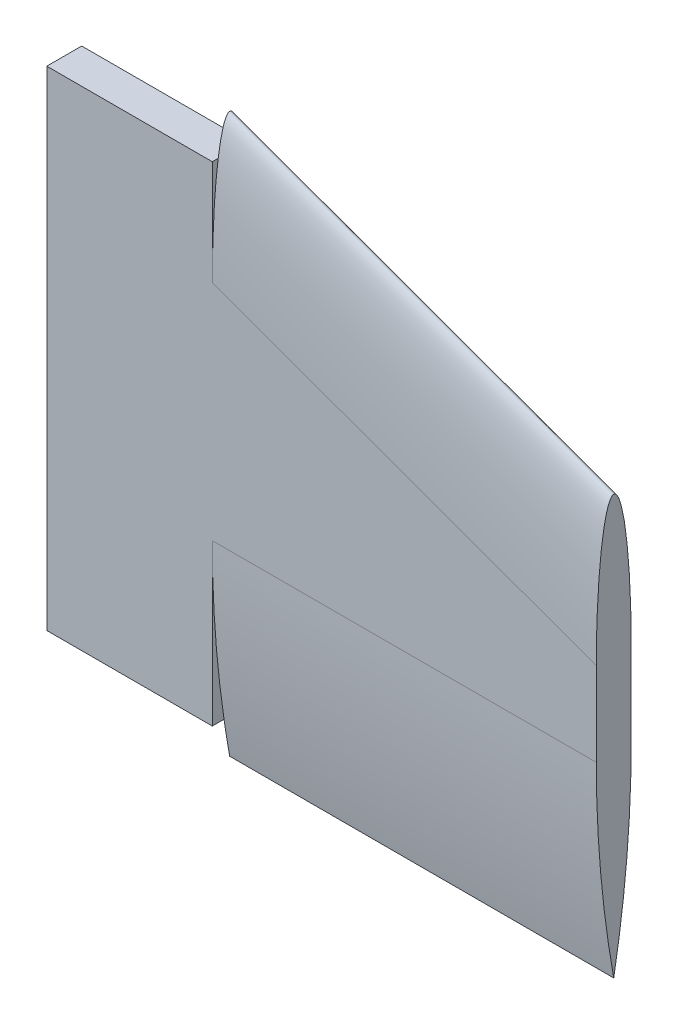
ISO-10303-21;
HEADER;
FILE_DESCRIPTION(('STEP AP214'),'2;1');
FILE_NAME('part.step','',(''),(''),'','','');
FILE_SCHEMA(('AUTOMOTIVE_DESIGN { 1 0 10303 214 1 1 1 1 }'));
ENDSEC;
DATA;
#1=APPLICATION_CONTEXT('core data for automotive mechanical design processes');
#2=APPLICATION_PROTOCOL_DEFINITION('international standard','automotive_design',2000,#1);
#3=PRODUCT_CONTEXT('',#1,'mechanical');
#4=PRODUCT('Part','Part','',(#3));
#5=PRODUCT_RELATED_PRODUCT_CATEGORY('part','',(#4));
#6=PRODUCT_DEFINITION_FORMATION('','',#4);
#7=PRODUCT_DEFINITION_CONTEXT('part definition',#1,'design');
#8=PRODUCT_DEFINITION('design','',#6,#7);
#9=PRODUCT_DEFINITION_SHAPE('','',#8);
#10=(LENGTH_UNIT() NAMED_UNIT(*) SI_UNIT(.MILLI.,.METRE.));
#11=(NAMED_UNIT(*) PLANE_ANGLE_UNIT() SI_UNIT($,.RADIAN.));
#12=(NAMED_UNIT(*) SI_UNIT($,.STERADIAN.) SOLID_ANGLE_UNIT());
#13=UNCERTAINTY_MEASURE_WITH_UNIT(LENGTH_MEASURE(1.E-05),#10,'distance_accuracy_value','');
#14=(GEOMETRIC_REPRESENTATION_CONTEXT(3) GLOBAL_UNCERTAINTY_ASSIGNED_CONTEXT((#13)) GLOBAL_UNIT_ASSIGNED_CONTEXT((#10,
#11,#12)) REPRESENTATION_CONTEXT('',''));
#15=CARTESIAN_POINT('',(0.,0.,0.));
#16=DIRECTION('',(0.,0.,1.));
#17=DIRECTION('',(1.,0.,0.));
#18=AXIS2_PLACEMENT_3D('',#15,#16,#17);
#19=CARTESIAN_POINT('',(78.7,55.,5.));
#20=DIRECTION('',(-1.,0.,0.));
#21=DIRECTION('',(0.,-1.,0.));
#22=AXIS2_PLACEMENT_3D('',#19,#20,#21);
#23=PLANE('',#22);
#24=CARTESIAN_POINT('',(78.7,23.,-153.05));
#25=DIRECTION('',(1.,0.,0.));
#26=DIRECTION('',(0.,1.,0.));
#27=AXIS2_PLACEMENT_3D('',#24,#25,#26);
#28=CIRCLE('',#27,158.05);
#29=CARTESIAN_POINT('',(78.7,23.,5.));
#30=VERTEX_POINT('',#29);
#31=CARTESIAN_POINT('',(78.7,-5.,2.5));
#32=VERTEX_POINT('',#31);
#33=EDGE_CURVE('E266',#30,#32,#28,.T.);
#34=ORIENTED_EDGE('',*,*,#33,.T.);
#35=CARTESIAN_POINT('',(78.7,23.,158.05));
#36=DIRECTION('',(1.,0.,0.));
#37=DIRECTION('',(0.,1.,0.));
#38=AXIS2_PLACEMENT_3D('',#35,#36,#37);
#39=CIRCLE('',#38,158.05);
#40=CARTESIAN_POINT('',(78.7,23.,0.));
#41=VERTEX_POINT('',#40);
#42=EDGE_CURVE('E304',#41,#32,#39,.F.);
#43=ORIENTED_EDGE('',*,*,#42,.F.);
#44=DIRECTION('',(0.,1.,0.));
#45=VECTOR('',#44,1.);
#46=CARTESIAN_POINT('',(78.7,55.,0.));
#47=LINE('',#46,#45);
#48=CARTESIAN_POINT('',(78.7,35.,0.));
#49=VERTEX_POINT('',#48);
#50=EDGE_CURVE('E143',#41,#49,#47,.T.);
#51=ORIENTED_EDGE('',*,*,#50,.T.);
#52=CARTESIAN_POINT('',(78.7,35.,2.5));
#53=DIRECTION('',(1.,0.,0.));
#54=DIRECTION('',(0.,1.,0.));
#55=AXIS2_PLACEMENT_3D('',#52,#53,#54);
#56=ELLIPSE('',#55,20.,2.5);
#57=CARTESIAN_POINT('',(78.7,35.,5.));
#58=VERTEX_POINT('',#57);
#59=EDGE_CURVE('E178',#49,#58,#56,.T.);
#60=ORIENTED_EDGE('',*,*,#59,.T.);
#61=DIRECTION('',(0.,1.,0.));
#62=VECTOR('',#61,1.);
#63=CARTESIAN_POINT('',(78.7,55.,5.));
#64=LINE('',#63,#62);
#65=EDGE_CURVE('E129',#30,#58,#64,.T.);
#66=ORIENTED_EDGE('',*,*,#65,.F.);
#67=EDGE_LOOP('',(#34,#43,#51,#60,#66));
#68=FACE_BOUND('',#67,.T.);
#69=ADVANCED_FACE('F58',(#68),#23,.F.);
#70=CARTESIAN_POINT('',(23.7,-5.,5.));
#71=DIRECTION('',(1.,0.,0.));
#72=DIRECTION('',(0.,1.,0.));
#73=AXIS2_PLACEMENT_3D('',#70,#71,#72);
#74=PLANE('',#73);
#75=DIRECTION('',(0.,0.,-1.));
#76=VECTOR('',#75,1.);
#77=CARTESIAN_POINT('',(23.7,0.,5.));
#78=LINE('',#77,#76);
#79=CARTESIAN_POINT('',(23.7,0.,3.31752380209902));
#80=VERTEX_POINT('',#79);
#81=CARTESIAN_POINT('',(23.7,0.,1.68247619790099));
#82=VERTEX_POINT('',#81);
#83=EDGE_CURVE('E68',#80,#82,#78,.T.);
#84=ORIENTED_EDGE('',*,*,#83,.T.);
#85=CARTESIAN_POINT('',(23.6999999999999,23.,158.05));
#86=DIRECTION('',(1.,0.,0.));
#87=DIRECTION('',(0.,1.,0.));
#88=AXIS2_PLACEMENT_3D('',#85,#86,#87);
#89=CIRCLE('',#88,158.05);
#90=CARTESIAN_POINT('',(23.6999999999996,-5.00000000000001,2.5));
#91=VERTEX_POINT('',#90);
#92=EDGE_CURVE('E259',#91,#82,#89,.T.);
#93=ORIENTED_EDGE('',*,*,#92,.F.);
#94=CARTESIAN_POINT('',(23.6999999999999,23.,-153.05));
#95=DIRECTION('',(1.,0.,0.));
#96=DIRECTION('',(0.,1.,0.));
#97=AXIS2_PLACEMENT_3D('',#94,#95,#96);
#98=CIRCLE('',#97,158.05);
#99=EDGE_CURVE('E248',#91,#80,#98,.F.);
#100=ORIENTED_EDGE('',*,*,#99,.T.);
#101=EDGE_LOOP('',(#84,#93,#100));
#102=FACE_BOUND('',#101,.T.);
#103=ADVANCED_FACE('F256',(#102),#74,.F.);
#104=CARTESIAN_POINT('',(0.,0.,0.));
#105=DIRECTION('',(0.,0.,-1.));
#106=DIRECTION('',(-1.,0.,0.));
#107=AXIS2_PLACEMENT_3D('',#104,#105,#106);
#108=PLANE('',#107);
#109=ORIENTED_EDGE('',*,*,#50,.F.);
#110=DIRECTION('',(1.,0.,0.));
#111=VECTOR('',#110,1.);
#112=CARTESIAN_POINT('',(-4.4113855937412,23.,0.));
#113=LINE('',#112,#111);
#114=CARTESIAN_POINT('',(23.6999999999999,23.,0.));
#115=VERTEX_POINT('',#114);
#116=EDGE_CURVE('E302',#115,#41,#113,.T.);
#117=ORIENTED_EDGE('',*,*,#116,.F.);
#118=DIRECTION('',(0.,-1.,0.));
#119=VECTOR('',#118,1.);
#120=CARTESIAN_POINT('',(23.7,0.,0.));
#121=LINE('',#120,#119);
#122=CARTESIAN_POINT('',(23.7,0.,0.));
#123=VERTEX_POINT('',#122);
#124=EDGE_CURVE('E309',#115,#123,#121,.T.);
#125=ORIENTED_EDGE('',*,*,#124,.T.);
#126=DIRECTION('',(1.,0.,0.));
#127=VECTOR('',#126,1.);
#128=CARTESIAN_POINT('',(23.7,0.,0.));
#129=LINE('',#128,#127);
#130=CARTESIAN_POINT('',(0.,0.,0.));
#131=VERTEX_POINT('',#130);
#132=EDGE_CURVE('E139',#131,#123,#129,.T.);
#133=ORIENTED_EDGE('',*,*,#132,.F.);
#134=DIRECTION('',(0.,-1.,0.));
#135=VECTOR('',#134,1.);
#136=CARTESIAN_POINT('',(0.,0.,0.));
#137=LINE('',#136,#135);
#138=CARTESIAN_POINT('',(0.,70.,0.));
#139=VERTEX_POINT('',#138);
#140=EDGE_CURVE('E149',#139,#131,#137,.T.);
#141=ORIENTED_EDGE('',*,*,#140,.F.);
#142=DIRECTION('',(-1.,0.,0.));
#143=VECTOR('',#142,1.);
#144=CARTESIAN_POINT('',(0.,70.,0.));
#145=LINE('',#144,#143);
#146=CARTESIAN_POINT('',(23.6999999999999,70.,0.));
#147=VERTEX_POINT('',#146);
#148=EDGE_CURVE('E88',#147,#139,#145,.T.);
#149=ORIENTED_EDGE('',*,*,#148,.F.);
#150=DIRECTION('',(0.,-1.,0.));
#151=VECTOR('',#150,1.);
#152=CARTESIAN_POINT('',(23.6999999999991,27.1086884357353,0.));
#153=LINE('',#152,#151);
#154=CARTESIAN_POINT('',(23.6999999999996,55.0000000000002,0.));
#155=VERTEX_POINT('',#154);
#156=EDGE_CURVE('E176',#147,#155,#153,.T.);
#157=ORIENTED_EDGE('',*,*,#156,.T.);
#158=DIRECTION('',(0.939793423488437,-0.341743063086705,0.));
#159=VECTOR('',#158,1.);
#160=CARTESIAN_POINT('',(4.1511068017271,62.1086884357356,0.));
#161=LINE('',#160,#159);
#162=EDGE_CURVE('E183',#155,#49,#161,.T.);
#163=ORIENTED_EDGE('',*,*,#162,.T.);
#164=EDGE_LOOP('',(#109,#117,#125,#133,#141,#149,#157,#163));
#165=FACE_BOUND('',#164,.T.);
#166=ADVANCED_FACE('F281',(#165),#108,.T.);
#167=CARTESIAN_POINT('',(23.6999999999999,70.,5.));
#168=DIRECTION('',(1.,0.,0.));
#169=DIRECTION('',(0.,1.,0.));
#170=AXIS2_PLACEMENT_3D('',#167,#168,#169);
#171=PLANE('',#170);
#172=CARTESIAN_POINT('',(23.6999999999996,55.0000000000001,5.));
#173=CARTESIAN_POINT('',(23.6999999999996,55.5720004388795,4.99997488519982));
#174=CARTESIAN_POINT('',(23.6999999999997,56.144002696193,4.99693141602449));
#175=CARTESIAN_POINT('',(23.6999999999997,57.2879536627689,4.98463095757736));
#176=CARTESIAN_POINT('',(23.6999999999997,57.8599023704369,4.97537382074938));
#177=CARTESIAN_POINT('',(23.6999999999997,59.0036644576573,4.95046914389847));
#178=CARTESIAN_POINT('',(23.6999999999997,59.5754778365877,4.93482157505513));
#179=CARTESIAN_POINT('',(23.6999999999997,60.7188764442921,4.8967579252481));
#180=CARTESIAN_POINT('',(23.6999999999998,61.2904616748312,4.87434189770684));
#181=CARTESIAN_POINT('',(23.6999999999998,62.433327992949,4.82216211654355));
#182=CARTESIAN_POINT('',(23.6999999999998,63.0046090644195,4.79239800635156));
#183=CARTESIAN_POINT('',(23.6999999999998,64.1466791661226,4.72464145556082));
#184=CARTESIAN_POINT('',(23.6999999999998,64.7174682025078,4.68664911939573));
#185=CARTESIAN_POINT('',(23.6999999999998,65.8584275394749,4.60111055722037));
#186=CARTESIAN_POINT('',(23.6999999999999,66.428597740071,4.55356296780028));
#187=CARTESIAN_POINT('',(23.6999999999999,67.2830238536229,4.47346948162913));
#188=CARTESIAN_POINT('',(23.6999999999999,67.5676927821685,4.44530981658054));
#189=CARTESIAN_POINT('',(23.6999999999999,68.1366806467353,4.38566017037873));
#190=CARTESIAN_POINT('',(23.6999999999999,68.4209995862597,4.35417022283985));
#191=CARTESIAN_POINT('',(23.6999999999999,69.0618234563637,4.27880492355437));
#192=CARTESIAN_POINT('',(23.6999999999999,69.4181992662104,4.23382139317495));
#193=CARTESIAN_POINT('',(23.6999999999999,70.1299349019455,4.13633199524896));
#194=CARTESIAN_POINT('',(23.6999999999999,70.4852947428011,4.08382623910717));
#195=CARTESIAN_POINT('',(23.6999999999999,71.079966111065,3.98738676032595));
#196=CARTESIAN_POINT('',(23.6999999999999,71.3197146520283,3.94615594705026));
#197=CARTESIAN_POINT('',(23.6999999999999,71.7981391093134,3.8578806578543));
#198=CARTESIAN_POINT('',(23.6999999999999,72.0368151113113,3.81083665517477));
#199=CARTESIAN_POINT('',(23.7,72.4363016405699,3.72523973527163));
#200=CARTESIAN_POINT('',(23.7,72.597562391991,3.68879456718261));
#201=CARTESIAN_POINT('',(23.7,72.9189981651544,3.61125273657672));
#202=CARTESIAN_POINT('',(23.7,73.0791730823828,3.57015563285419));
#203=CARTESIAN_POINT('',(23.7,73.3473629227435,3.49564855876825));
#204=CARTESIAN_POINT('',(23.7,73.4558436171766,3.46392157541193));
#205=CARTESIAN_POINT('',(23.7,73.671580658925,3.39666622662821));
#206=CARTESIAN_POINT('',(23.7,73.7788375929399,3.36113977547956));
#207=CARTESIAN_POINT('',(23.7,73.9584288067411,3.29674402046781));
#208=CARTESIAN_POINT('',(23.7,74.0312493873934,3.26924081175469));
#209=CARTESIAN_POINT('',(23.7,74.1756935186942,3.21099098100012));
#210=CARTESIAN_POINT('',(23.7,74.2473155429742,3.18024054106987));
#211=CARTESIAN_POINT('',(23.7,74.386176597405,3.11550565133565));
#212=CARTESIAN_POINT('',(23.7,74.4534817890112,3.08166740579188));
#213=CARTESIAN_POINT('',(23.7,74.5519053884584,3.0265637802056));
#214=CARTESIAN_POINT('',(23.7,74.5842511685421,3.00749865373645));
#215=CARTESIAN_POINT('',(23.7,74.6478256295048,2.96753460090543));
#216=CARTESIAN_POINT('',(23.7,74.6790537975318,2.94663484747768));
#217=CARTESIAN_POINT('',(23.7,74.7363257769538,2.9050939709535));
#218=CARTESIAN_POINT('',(23.7,74.7625504448733,2.88470479128764));
#219=CARTESIAN_POINT('',(23.7,74.8130750788164,2.84169326167561));
#220=CARTESIAN_POINT('',(23.7,74.8373776803399,2.81907406862752));
#221=CARTESIAN_POINT('',(23.7,74.8834528114579,2.77062449373802));
#222=CARTESIAN_POINT('',(23.7,74.9051780891119,2.74474811143269));
#223=CARTESIAN_POINT('',(23.7,74.9436663388231,2.68951856317908));
#224=CARTESIAN_POINT('',(23.7,74.9604529253396,2.66018291406145));
#225=CARTESIAN_POINT('',(23.7,74.9817551484157,2.60870447367483));
#226=CARTESIAN_POINT('',(23.7,74.9885022980104,2.58750611406828));
#227=CARTESIAN_POINT('',(23.7,74.9976177941652,2.54420149170384));
#228=CARTESIAN_POINT('',(23.7,74.999997694106,2.5220977830347));
#229=CARTESIAN_POINT('',(23.7,75.0000020794716,2.48007206282373));
#230=CARTESIAN_POINT('',(23.7,74.9980705662995,2.46014894470526));
#231=CARTESIAN_POINT('',(23.7,74.9906222272487,2.42097290369096));
#232=CARTESIAN_POINT('',(23.7,74.985099122873,2.40172121674288));
#233=CARTESIAN_POINT('',(23.7,74.9690774229299,2.35895445753588));
#234=CARTESIAN_POINT('',(23.7,74.9576029389327,2.33581237100939));
#235=CARTESIAN_POINT('',(23.7,74.9311936192979,2.29161402067852));
#236=CARTESIAN_POINT('',(23.7,74.9162512909001,2.27056241633659));
#237=CARTESIAN_POINT('',(23.7,74.885292949687,2.23198707660666));
#238=CARTESIAN_POINT('',(23.7,74.869456648164,2.21431593155001));
#239=CARTESIAN_POINT('',(23.7,74.8363383138934,2.18037104962036));
#240=CARTESIAN_POINT('',(23.7,74.8190549474168,2.16409863054508));
#241=CARTESIAN_POINT('',(23.7,74.7833920798095,2.13271454405103));
#242=CARTESIAN_POINT('',(23.7,74.7650097466571,2.11760612736232));
#243=CARTESIAN_POINT('',(23.7,74.7274604629157,2.0884244465087));
#244=CARTESIAN_POINT('',(23.7,74.7082938565375,2.07435073564677));
#245=CARTESIAN_POINT('',(23.7,74.6554523949701,2.03734095975633));
#246=CARTESIAN_POINT('',(23.7,74.6211868659335,2.01524941140817));
#247=CARTESIAN_POINT('',(23.7,74.5514420908496,1.97306001433129));
#248=CARTESIAN_POINT('',(23.7,74.5159621025146,1.95296341528777));
#249=CARTESIAN_POINT('',(23.7,74.4081116333862,1.89498234461647));
#250=CARTESIAN_POINT('',(23.7,74.3344586080401,1.85949070499231));
#251=CARTESIAN_POINT('',(23.7,74.1849206859794,1.79272516176864));
#252=CARTESIAN_POINT('',(23.7,74.1090271055555,1.76147133947761));
#253=CARTESIAN_POINT('',(23.7,73.9560814934608,1.70226133138419));
#254=CARTESIAN_POINT('',(23.7,73.8790310209191,1.67430109033172));
#255=CARTESIAN_POINT('',(23.7,73.7097418409383,1.61595698386843));
#256=CARTESIAN_POINT('',(23.7,73.6173296095385,1.58608123937834));
#257=CARTESIAN_POINT('',(23.7,73.431660250649,1.529059887038));
#258=CARTESIAN_POINT('',(23.7,73.3384030048575,1.50191466810478));
#259=CARTESIAN_POINT('',(23.7,73.1512033432352,1.44980621969118));
#260=CARTESIAN_POINT('',(23.7,73.0572604358995,1.42484476586702));
#261=CARTESIAN_POINT('',(23.7,72.8689058315821,1.37675177469862));
#262=CARTESIAN_POINT('',(23.7,72.7744941143263,1.35362031723901));
#263=CARTESIAN_POINT('',(23.7,72.4913337365068,1.28668374573607));
#264=CARTESIAN_POINT('',(23.7,72.3020432171085,1.2451693281));
#265=CARTESIAN_POINT('',(23.6999999999999,71.9225948106389,1.16677471583674));
#266=CARTESIAN_POINT('',(23.6999999999999,71.7324372744374,1.12989279382937));
#267=CARTESIAN_POINT('',(23.6999999999999,71.3520314683217,1.05991946495273));
#268=CARTESIAN_POINT('',(23.6999999999999,71.1617852605054,1.02681679339584));
#269=CARTESIAN_POINT('',(23.6999999999999,70.7807771762971,0.963634068583763));
#270=CARTESIAN_POINT('',(23.6999999999999,70.5900152529587,0.933554300722787));
#271=CARTESIAN_POINT('',(23.6999999999999,70.0170031948051,0.847114816925548));
#272=CARTESIAN_POINT('',(23.6999999999999,69.6341750673412,0.79458135653284));
#273=CARTESIAN_POINT('',(23.6999999999999,68.8676184858261,0.697285760413486));
#274=CARTESIAN_POINT('',(23.6999999999999,68.4838901932423,0.652522325051098));
#275=CARTESIAN_POINT('',(23.6999999999999,67.7157390510039,0.569293116986057));
#276=CARTESIAN_POINT('',(23.6999999999999,67.3313161725478,0.530827611785699));
#277=CARTESIAN_POINT('',(23.6999999999999,66.5620065337947,0.459206034539146));
#278=CARTESIAN_POINT('',(23.6999999999998,66.1771198063277,0.426049606684697));
#279=CARTESIAN_POINT('',(23.6999999999998,65.4069737301892,0.364350304300425));
#280=CARTESIAN_POINT('',(23.6999999999998,65.0217143764712,0.335807493160833));
#281=CARTESIAN_POINT('',(23.6999999999998,64.2357041088384,0.281784251470409));
#282=CARTESIAN_POINT('',(23.6999999999998,63.8349418790811,0.256469140801798));
#283=CARTESIAN_POINT('',(23.6999999999998,63.0331824702206,0.209861020970648));
#284=CARTESIAN_POINT('',(23.6999999999998,62.6321852891955,0.188568045185963));
#285=CARTESIAN_POINT('',(23.6999999999998,61.4289449335811,0.130233791579415));
#286=CARTESIAN_POINT('',(23.6999999999997,60.6264293237781,0.098735605502849));
#287=CARTESIAN_POINT('',(23.6999999999997,59.0199991116041,0.048838427815553));
#288=CARTESIAN_POINT('',(23.6999999999997,58.2160840123996,0.0304558153104482));
#289=CARTESIAN_POINT('',(23.6999999999997,57.0100971016644,0.0121447661575951));
#290=CARTESIAN_POINT('',(23.6999999999997,56.6080906629853,0.00758489324828378));
#291=CARTESIAN_POINT('',(23.6999999999997,55.8040565769501,0.00151472190236812));
#292=CARTESIAN_POINT('',(23.6999999999996,55.4020289297007,4.40933902171027E-06));
#293=CARTESIAN_POINT('',(23.6999999999996,55.0000000000001,0.));
#294=B_SPLINE_CURVE_WITH_KNOTS('',3,(#172,#173,#174,#175,#176,#177,#178,#179,#180,#181,#182,
#183,#184,#185,#186,#187,#188,#189,#190,#191,#192,#193,#194,#195,#196,#197,#198,#199,#200,#201,
#202,#203,#204,#205,#206,#207,#208,#209,#210,#211,#212,#213,#214,#215,#216,#217,#218,#219,#220,
#221,#222,#223,#224,#225,#226,#227,#228,#229,#230,#231,#232,#233,#234,#235,#236,#237,#238,#239,
#240,#241,#242,#243,#244,#245,#246,#247,#248,#249,#250,#251,#252,#253,#254,#255,#256,#257,#258,
#259,#260,#261,#262,#263,#264,#265,#266,#267,#268,#269,#270,#271,#272,#273,#274,#275,#276,#277,
#278,#279,#280,#281,#282,#283,#284,#285,#286,#287,#288,#289,#290,#291,#292,#293),.UNSPECIFIED.,
.F.,.F.,(4,2,2,2,2,2,2,2,2,2,2,2,2,2,2,2,2,2,2,2,2,2,2,2,2,2,2,2,2,2,2,2,2,2,2,2,2,2,2,2,2,2,2,
2,2,2,2,2,2,2,2,2,2,2,2,2,2,2,2,2,4),(0.,1.71599615077384,3.43203305280663,5.14807769412917,
6.86410879132183,8.58022317628935,10.2963157813946,12.0126534245768,12.8708127178166,
13.7289633500175,14.8065149463981,15.8840505858027,16.6138057869719,17.3435016192407,
17.8394387557628,18.3354229681511,18.6744504962383,19.0133080103135,19.2467739450678,
19.4805174966926,19.706283045999,19.8188784287908,19.9315248338324,20.031086660977,
20.1305095146965,20.2315396252693,20.3320784999231,20.3984435996494,20.4646328787025,
20.5243228391226,20.5841174256886,20.6611680881805,20.7383868052754,20.8094685567981,
20.8806165596798,20.9519565524597,21.0232655636786,21.145473438689,21.2677573909171,
21.5127827919942,21.7589314660259,22.00477382739,22.2960831250134,22.5874338561252,
22.879019329296,23.1706175240001,23.7518983265195,24.3329617315812,24.9122452799682,
25.4915834675967,26.6507115794249,27.8096456250839,28.9686288832824,30.127534435217,
31.2864559089438,32.4911159622795,33.6957860120979,36.1050550965806,38.5173277041146,
39.7234145618277,40.9294958324676),.UNSPECIFIED.);
#295=CARTESIAN_POINT('',(23.6999999999999,70.,4.15359456941537));
#296=VERTEX_POINT('',#295);
#297=CARTESIAN_POINT('',(23.6999999999999,70.,0.846405430584626));
#298=VERTEX_POINT('',#297);
#299=EDGE_CURVE('E98',#296,#298,#294,.T.);
#300=ORIENTED_EDGE('',*,*,#299,.T.);
#301=DIRECTION('',(0.,0.,-1.));
#302=VECTOR('',#301,1.);
#303=CARTESIAN_POINT('',(23.6999999999999,70.,5.));
#304=LINE('',#303,#302);
#305=EDGE_CURVE('E117',#296,#298,#304,.T.);
#306=ORIENTED_EDGE('',*,*,#305,.F.);
#307=EDGE_LOOP('',(#300,#306));
#308=FACE_BOUND('',#307,.T.);
#309=ADVANCED_FACE('F165',(#308),#171,.F.);
#310=CARTESIAN_POINT('',(0.,0.,5.));
#311=DIRECTION('',(0.,0.,-1.));
#312=DIRECTION('',(-1.,0.,0.));
#313=AXIS2_PLACEMENT_3D('',#310,#311,#312);
#314=PLANE('',#313);
#315=DIRECTION('',(0.,1.,0.));
#316=VECTOR('',#315,1.);
#317=CARTESIAN_POINT('',(23.7,0.,5.));
#318=LINE('',#317,#316);
#319=CARTESIAN_POINT('',(23.7,0.,5.));
#320=VERTEX_POINT('',#319);
#321=CARTESIAN_POINT('',(23.6999999999999,23.,5.));
#322=VERTEX_POINT('',#321);
#323=EDGE_CURVE('E189',#320,#322,#318,.T.);
#324=ORIENTED_EDGE('',*,*,#323,.T.);
#325=DIRECTION('',(1.,0.,0.));
#326=VECTOR('',#325,1.);
#327=CARTESIAN_POINT('',(-4.4113855937412,23.,5.));
#328=LINE('',#327,#326);
#329=EDGE_CURVE('E250',#322,#30,#328,.T.);
#330=ORIENTED_EDGE('',*,*,#329,.T.);
#331=ORIENTED_EDGE('',*,*,#65,.T.);
#332=DIRECTION('',(0.939793423488437,-0.341743063086705,0.));
#333=VECTOR('',#332,1.);
#334=CARTESIAN_POINT('',(4.1511068017271,62.1086884357356,5.));
#335=LINE('',#334,#333);
#336=CARTESIAN_POINT('',(23.6999999999996,55.0000000000001,5.));
#337=VERTEX_POINT('',#336);
#338=EDGE_CURVE('E123',#337,#58,#335,.T.);
#339=ORIENTED_EDGE('',*,*,#338,.F.);
#340=DIRECTION('',(0.,1.,0.));
#341=VECTOR('',#340,1.);
#342=CARTESIAN_POINT('',(23.6999999999991,27.1086884357353,5.));
#343=LINE('',#342,#341);
#344=CARTESIAN_POINT('',(23.6999999999999,70.,5.));
#345=VERTEX_POINT('',#344);
#346=EDGE_CURVE('E110',#337,#345,#343,.T.);
#347=ORIENTED_EDGE('',*,*,#346,.T.);
#348=DIRECTION('',(-1.,0.,0.));
#349=VECTOR('',#348,1.);
#350=CARTESIAN_POINT('',(0.,70.,5.));
#351=LINE('',#350,#349);
#352=CARTESIAN_POINT('',(0.,70.,5.));
#353=VERTEX_POINT('',#352);
#354=EDGE_CURVE('E120',#345,#353,#351,.T.);
#355=ORIENTED_EDGE('',*,*,#354,.T.);
#356=DIRECTION('',(0.,-1.,0.));
#357=VECTOR('',#356,1.);
#358=CARTESIAN_POINT('',(0.,0.,5.));
#359=LINE('',#358,#357);
#360=CARTESIAN_POINT('',(0.,0.,5.));
#361=VERTEX_POINT('',#360);
#362=EDGE_CURVE('E76',#353,#361,#359,.T.);
#363=ORIENTED_EDGE('',*,*,#362,.T.);
#364=DIRECTION('',(1.,0.,0.));
#365=VECTOR('',#364,1.);
#366=CARTESIAN_POINT('',(23.7,0.,5.));
#367=LINE('',#366,#365);
#368=EDGE_CURVE('E135',#361,#320,#367,.T.);
#369=ORIENTED_EDGE('',*,*,#368,.T.);
#370=EDGE_LOOP('',(#324,#330,#331,#339,#347,#355,#363,#369));
#371=FACE_BOUND('',#370,.T.);
#372=ADVANCED_FACE('F119',(#371),#314,.F.);
#373=CARTESIAN_POINT('',(23.7,0.,5.));
#374=DIRECTION('',(0.,1.,0.));
#375=DIRECTION('',(-1.,0.,0.));
#376=AXIS2_PLACEMENT_3D('',#373,#374,#375);
#377=PLANE('',#376);
#378=ORIENTED_EDGE('',*,*,#132,.T.);
#379=DIRECTION('',(0.,0.,-1.));
#380=VECTOR('',#379,1.);
#381=CARTESIAN_POINT('',(23.7,0.,5.));
#382=LINE('',#381,#380);
#383=EDGE_CURVE('E264',#82,#123,#382,.T.);
#384=ORIENTED_EDGE('',*,*,#383,.F.);
#385=ORIENTED_EDGE('',*,*,#83,.F.);
#386=EDGE_CURVE('E12',#320,#80,#78,.T.);
#387=ORIENTED_EDGE('',*,*,#386,.F.);
#388=ORIENTED_EDGE('',*,*,#368,.F.);
#389=DIRECTION('',(0.,0.,-1.));
#390=VECTOR('',#389,1.);
#391=CARTESIAN_POINT('',(0.,0.,5.));
#392=LINE('',#391,#390);
#393=EDGE_CURVE('E133',#361,#131,#392,.T.);
#394=ORIENTED_EDGE('',*,*,#393,.T.);
#395=EDGE_LOOP('',(#378,#384,#385,#387,#388,#394));
#396=FACE_BOUND('',#395,.T.);
#397=ADVANCED_FACE('F60',(#396),#377,.F.);
#398=CARTESIAN_POINT('',(0.,70.,5.));
#399=DIRECTION('',(0.,-1.,0.));
#400=DIRECTION('',(0.,0.,-1.));
#401=AXIS2_PLACEMENT_3D('',#398,#399,#400);
#402=PLANE('',#401);
#403=ORIENTED_EDGE('',*,*,#148,.T.);
#404=DIRECTION('',(0.,0.,-1.));
#405=VECTOR('',#404,1.);
#406=CARTESIAN_POINT('',(0.,70.,5.));
#407=LINE('',#406,#405);
#408=EDGE_CURVE('E127',#353,#139,#407,.T.);
#409=ORIENTED_EDGE('',*,*,#408,.F.);
#410=ORIENTED_EDGE('',*,*,#354,.F.);
#411=EDGE_CURVE('E107',#345,#296,#304,.T.);
#412=ORIENTED_EDGE('',*,*,#411,.T.);
#413=ORIENTED_EDGE('',*,*,#305,.T.);
#414=DIRECTION('',(0.,0.,1.));
#415=VECTOR('',#414,1.);
#416=CARTESIAN_POINT('',(23.6999999999999,70.,5.));
#417=LINE('',#416,#415);
#418=EDGE_CURVE('E162',#147,#298,#417,.T.);
#419=ORIENTED_EDGE('',*,*,#418,.F.);
#420=EDGE_LOOP('',(#403,#409,#410,#412,#413,#419));
#421=FACE_BOUND('',#420,.T.);
#422=ADVANCED_FACE('F126',(#421),#402,.F.);
#423=CARTESIAN_POINT('',(0.,0.,5.));
#424=DIRECTION('',(1.,0.,0.));
#425=DIRECTION('',(0.,0.,-1.));
#426=AXIS2_PLACEMENT_3D('',#423,#424,#425);
#427=PLANE('',#426);
#428=ORIENTED_EDGE('',*,*,#140,.T.);
#429=ORIENTED_EDGE('',*,*,#393,.F.);
#430=ORIENTED_EDGE('',*,*,#362,.F.);
#431=ORIENTED_EDGE('',*,*,#408,.T.);
#432=EDGE_LOOP('',(#428,#429,#430,#431));
#433=FACE_BOUND('',#432,.T.);
#434=ADVANCED_FACE('F211',(#433),#427,.F.);
#435=CARTESIAN_POINT('',(23.6999999999999,70.,5.));
#436=DIRECTION('',(1.,0.,0.));
#437=DIRECTION('',(0.,1.,0.));
#438=AXIS2_PLACEMENT_3D('',#435,#436,#437);
#439=PLANE('',#438);
#440=ORIENTED_EDGE('',*,*,#411,.F.);
#441=ORIENTED_EDGE('',*,*,#346,.F.);
#442=EDGE_CURVE('E112',#337,#296,#294,.T.);
#443=ORIENTED_EDGE('',*,*,#442,.T.);
#444=EDGE_LOOP('',(#440,#441,#443));
#445=FACE_BOUND('',#444,.T.);
#446=ADVANCED_FACE('F109',(#445),#439,.T.);
#447=CARTESIAN_POINT('',(4.1511068017271,62.1086884357356,2.5));
#448=DIRECTION('',(1.,0.,0.));
#449=DIRECTION('',(0.,1.,0.));
#450=AXIS2_PLACEMENT_3D('',#447,#448,#449);
#451=ELLIPSE('',#450,20.,2.5);
#452=DIRECTION('',(0.939793423488437,-0.341743063086705,0.));
#453=VECTOR('',#452,1.);
#454=SURFACE_OF_LINEAR_EXTRUSION('',#451,#453);
#455=ORIENTED_EDGE('',*,*,#338,.T.);
#456=ORIENTED_EDGE('',*,*,#59,.F.);
#457=ORIENTED_EDGE('',*,*,#162,.F.);
#458=CARTESIAN_POINT('',(23.7,75.,2.5));
#459=CARTESIAN_POINT('',(23.7,75.0000042136937,2.48994343839511));
#460=CARTESIAN_POINT('',(23.7,74.9995141910002,2.47989326776371));
#461=CARTESIAN_POINT('',(23.7,74.9975857623277,2.45989935032554));
#462=CARTESIAN_POINT('',(23.7,74.9961488072464,2.44995546431839));
#463=CARTESIAN_POINT('',(23.7,74.9905313792137,2.42067013736417));
#464=CARTESIAN_POINT('',(23.7,74.9850417372372,2.40157199550245));
#465=CARTESIAN_POINT('',(23.7,74.9690968549742,2.35900119575021));
#466=CARTESIAN_POINT('',(23.7,74.9576520231023,2.33591004196755));
#467=CARTESIAN_POINT('',(23.7,74.9312575404135,2.29170539509219));
#468=CARTESIAN_POINT('',(23.7,74.9162857098476,2.2706056523227));
#469=CARTESIAN_POINT('',(23.7,74.8852846858752,2.23197645918264));
#470=CARTESIAN_POINT('',(23.7,74.8694391074506,2.21429626208946));
#471=CARTESIAN_POINT('',(23.7,74.8363008612856,2.18033435755991));
#472=CARTESIAN_POINT('',(23.7,74.8190068585861,2.16405396890938));
#473=CARTESIAN_POINT('',(23.7,74.7833416135611,2.13267248556185));
#474=CARTESIAN_POINT('',(23.7,74.7649686999294,2.11757330976967));
#475=CARTESIAN_POINT('',(23.7,74.727439265385,2.08840888962179));
#476=CARTESIAN_POINT('',(23.7,74.7082830899833,2.07434319687569));
#477=CARTESIAN_POINT('',(23.7,74.6554561931707,2.03734361648173));
#478=CARTESIAN_POINT('',(23.7,74.6211946616423,2.01525444121562));
#479=CARTESIAN_POINT('',(23.7,74.5514581076329,1.97306939117668));
#480=CARTESIAN_POINT('',(23.7,74.5159823432048,1.95297476549188));
#481=CARTESIAN_POINT('',(23.7,74.4081446681198,1.89499915372031));
#482=CARTESIAN_POINT('',(23.7,74.3345004038152,1.85951058449886));
#483=CARTESIAN_POINT('',(23.7,74.1849633408187,1.79274299632426));
#484=CARTESIAN_POINT('',(23.7,74.1090614291251,1.76148505048993));
#485=CARTESIAN_POINT('',(23.7,73.9560988533403,1.70226762980691));
#486=CARTESIAN_POINT('',(23.7,73.8790397489878,1.67430409814559));
#487=CARTESIAN_POINT('',(23.7,73.7097406515253,1.61595657423427));
#488=CARTESIAN_POINT('',(23.7,73.6173272157848,1.58608046512516));
#489=CARTESIAN_POINT('',(23.7,73.4316554302631,1.5290584456379));
#490=CARTESIAN_POINT('',(23.7,73.3383969621776,1.5019129241862));
#491=CARTESIAN_POINT('',(23.7,73.1511948451098,1.44980391609905));
#492=CARTESIAN_POINT('',(23.7,73.0572507046212,1.42484220513028));
#493=CARTESIAN_POINT('',(23.7,72.8688936266509,1.37674873419251));
#494=CARTESIAN_POINT('',(23.7,72.7744806688948,1.35361705410985));
#495=CARTESIAN_POINT('',(23.7,72.4913214623976,1.28668101438653));
#496=CARTESIAN_POINT('',(23.7,72.3020333847467,1.24516723372296));
#497=CARTESIAN_POINT('',(23.6999999999999,71.9225898807082,1.16677375994126));
#498=CARTESIAN_POINT('',(23.6999999999999,71.7324348051396,1.12989233969219));
#499=CARTESIAN_POINT('',(23.6999999999999,71.3520315132263,1.05991947313778));
#500=CARTESIAN_POINT('',(23.6999999999999,71.1617853503986,1.02681680902167));
#501=CARTESIAN_POINT('',(23.6999999999999,70.7807773850947,0.963634102492442));
#502=CARTESIAN_POINT('',(23.6999999999999,70.5900155357471,0.933554345017537));
#503=CARTESIAN_POINT('',(23.6999999999999,70.0170034332901,0.847114849604842));
#504=CARTESIAN_POINT('',(23.6999999999999,69.6341751868885,0.79458137179126));
#505=CARTESIAN_POINT('',(23.6999999999999,68.8676183139805,0.697285738517091));
#506=CARTESIAN_POINT('',(23.6999999999999,68.4838898488101,0.652522284479462));
#507=CARTESIAN_POINT('',(23.6999999999999,67.7157391958444,0.569293135931188));
#508=CARTESIAN_POINT('',(23.6999999999999,67.3313169807181,0.530827695266639));
#509=CARTESIAN_POINT('',(23.6999999999999,66.5620036140948,0.45920575448624));
#510=CARTESIAN_POINT('',(23.6999999999998,66.1771124890038,0.426048968191917));
#511=CARTESIAN_POINT('',(23.6999999999998,65.4069659341623,0.364349731980862));
#512=CARTESIAN_POINT('',(23.6999999999998,65.0217105072742,0.335807246106311));
#513=CARTESIAN_POINT('',(23.6999999999998,64.2357124983406,0.281784808464973));
#514=CARTESIAN_POINT('',(23.6999999999998,63.834958599127,0.256470121897254));
#515=CARTESIAN_POINT('',(23.6999999999998,63.0332159553541,0.209862958555264));
#516=CARTESIAN_POINT('',(23.6999999999998,62.6322272086557,0.188570519006135));
#517=CARTESIAN_POINT('',(23.6999999999998,61.4289768947989,0.130234456960116));
#518=CARTESIAN_POINT('',(23.6999999999997,60.6264401935411,0.0987326897176143));
#519=CARTESIAN_POINT('',(23.6999999999997,59.4218514773481,0.0613219550742173));
#520=CARTESIAN_POINT('',(23.6999999999997,59.0199410354446,0.0504883591537256));
#521=CARTESIAN_POINT('',(23.6999999999997,58.2160558066155,0.03200409495505));
#522=CARTESIAN_POINT('',(23.6999999999997,57.8140810216463,0.0243533434907689));
#523=CARTESIAN_POINT('',(23.6999999999997,57.0101010564617,0.0121435033771753));
#524=CARTESIAN_POINT('',(23.6999999999997,56.6080958780719,0.00758429273120075));
#525=CARTESIAN_POINT('',(23.6999999999997,55.8040604474984,0.00151539104280825));
#526=CARTESIAN_POINT('',(23.6999999999996,55.4020301951999,5.71519335421068E-06));
#527=CARTESIAN_POINT('',(23.6999999999996,55.0000000000001,0.));
#528=B_SPLINE_CURVE_WITH_KNOTS('',3,(#458,#459,#460,#461,#462,#463,#464,#465,#466,#467,#468,
#469,#470,#471,#472,#473,#474,#475,#476,#477,#478,#479,#480,#481,#482,#483,#484,#485,#486,#487,
#488,#489,#490,#491,#492,#493,#494,#495,#496,#497,#498,#499,#500,#501,#502,#503,#504,#505,#506,
#507,#508,#509,#510,#511,#512,#513,#514,#515,#516,#517,#518,#519,#520,#521,#522,#523,#524,#525,
#526,#527),.UNSPECIFIED.,.F.,.F.,(4,2,2,2,2,2,2,2,2,2,2,2,2,2,2,2,2,2,2,2,2,2,2,2,2,2,2,2,2,2,2,
2,2,2,4),(0.,0.0301462662504393,0.060246449200459,0.119552097942792,0.196438351270853,
0.273821661519306,0.344942737677019,0.416130100468281,0.487430805498399,0.558700390828812,
0.680894362120772,0.803164380945534,1.04816216220674,1.29433860431919,1.54020865866265,
1.83152172904963,2.12287623352264,2.41446547965452,2.70606744751707,3.28734069019338,
3.86839656332712,4.44767997488161,5.02701793839242,6.186146411154,7.3450809758961,
8.50406224086208,9.66298100651638,10.8218907406388,12.0265254574023,13.2311713222877,
15.6404899269293,16.846650788656,18.0527801244565,19.2588618618826,20.4649496080649),.UNSPECIFIED.);
#529=EDGE_CURVE('E173',#298,#155,#528,.T.);
#530=ORIENTED_EDGE('',*,*,#529,.F.);
#531=ORIENTED_EDGE('',*,*,#299,.F.);
#532=ORIENTED_EDGE('',*,*,#442,.F.);
#533=EDGE_LOOP('',(#455,#456,#457,#530,#531,#532));
#534=FACE_BOUND('',#533,.T.);
#535=ADVANCED_FACE('F180',(#534),#454,.T.);
#536=CARTESIAN_POINT('',(23.6999999999999,70.,5.));
#537=DIRECTION('',(1.,0.,0.));
#538=DIRECTION('',(0.,1.,0.));
#539=AXIS2_PLACEMENT_3D('',#536,#537,#538);
#540=PLANE('',#539);
#541=ORIENTED_EDGE('',*,*,#418,.T.);
#542=ORIENTED_EDGE('',*,*,#529,.T.);
#543=ORIENTED_EDGE('',*,*,#156,.F.);
#544=EDGE_LOOP('',(#541,#542,#543));
#545=FACE_BOUND('',#544,.T.);
#546=ADVANCED_FACE('F171',(#545),#540,.T.);
#547=CARTESIAN_POINT('',(23.7,-5.,5.));
#548=DIRECTION('',(1.,0.,0.));
#549=DIRECTION('',(0.,1.,0.));
#550=AXIS2_PLACEMENT_3D('',#547,#548,#549);
#551=PLANE('',#550);
#552=ORIENTED_EDGE('',*,*,#386,.T.);
#553=EDGE_CURVE('E239',#80,#322,#98,.F.);
#554=ORIENTED_EDGE('',*,*,#553,.T.);
#555=ORIENTED_EDGE('',*,*,#323,.F.);
#556=EDGE_LOOP('',(#552,#554,#555));
#557=FACE_BOUND('',#556,.T.);
#558=ADVANCED_FACE('F206',(#557),#551,.T.);
#559=CARTESIAN_POINT('',(-4.4113855937412,23.,-153.05));
#560=DIRECTION('',(1.,0.,0.));
#561=DIRECTION('',(0.,1.,0.));
#562=AXIS2_PLACEMENT_3D('',#559,#560,#561);
#563=CYLINDRICAL_SURFACE('',#562,158.05);
#564=DIRECTION('',(1.,0.,0.));
#565=VECTOR('',#564,1.);
#566=CARTESIAN_POINT('',(-4.41138559374119,-5.00000000000002,2.5));
#567=LINE('',#566,#565);
#568=EDGE_CURVE('E252',#91,#32,#567,.T.);
#569=ORIENTED_EDGE('',*,*,#568,.T.);
#570=ORIENTED_EDGE('',*,*,#33,.F.);
#571=ORIENTED_EDGE('',*,*,#329,.F.);
#572=ORIENTED_EDGE('',*,*,#553,.F.);
#573=ORIENTED_EDGE('',*,*,#99,.F.);
#574=EDGE_LOOP('',(#569,#570,#571,#572,#573));
#575=FACE_BOUND('',#574,.T.);
#576=ADVANCED_FACE('F207',(#575),#563,.T.);
#577=CARTESIAN_POINT('',(23.7,-5.,5.));
#578=DIRECTION('',(1.,0.,0.));
#579=DIRECTION('',(0.,1.,0.));
#580=AXIS2_PLACEMENT_3D('',#577,#578,#579);
#581=PLANE('',#580);
#582=ORIENTED_EDGE('',*,*,#383,.T.);
#583=ORIENTED_EDGE('',*,*,#124,.F.);
#584=EDGE_CURVE('E305',#82,#115,#89,.T.);
#585=ORIENTED_EDGE('',*,*,#584,.F.);
#586=EDGE_LOOP('',(#582,#583,#585));
#587=FACE_BOUND('',#586,.T.);
#588=ADVANCED_FACE('F411',(#587),#581,.T.);
#589=CARTESIAN_POINT('',(-4.4113855937412,23.,158.05));
#590=DIRECTION('',(1.,0.,0.));
#591=DIRECTION('',(0.,1.,0.));
#592=AXIS2_PLACEMENT_3D('',#589,#590,#591);
#593=CYLINDRICAL_SURFACE('',#592,158.05);
#594=ORIENTED_EDGE('',*,*,#92,.T.);
#595=ORIENTED_EDGE('',*,*,#584,.T.);
#596=ORIENTED_EDGE('',*,*,#116,.T.);
#597=ORIENTED_EDGE('',*,*,#42,.T.);
#598=ORIENTED_EDGE('',*,*,#568,.F.);
#599=EDGE_LOOP('',(#594,#595,#596,#597,#598));
#600=FACE_BOUND('',#599,.T.);
#601=ADVANCED_FACE('F303',(#600),#593,.T.);
#602=CLOSED_SHELL('',(#69,#103,#166,#309,#372,#397,#422,#434,#446,#535,#546,#558,#576,#588,#601));
#603=MANIFOLD_SOLID_BREP('B2',#602);
#604=ADVANCED_BREP_SHAPE_REPRESENTATION('',(#18,#603),#14);
#605=SHAPE_DEFINITION_REPRESENTATION(#9,#604);
ENDSEC;
END-ISO-10303-21;
